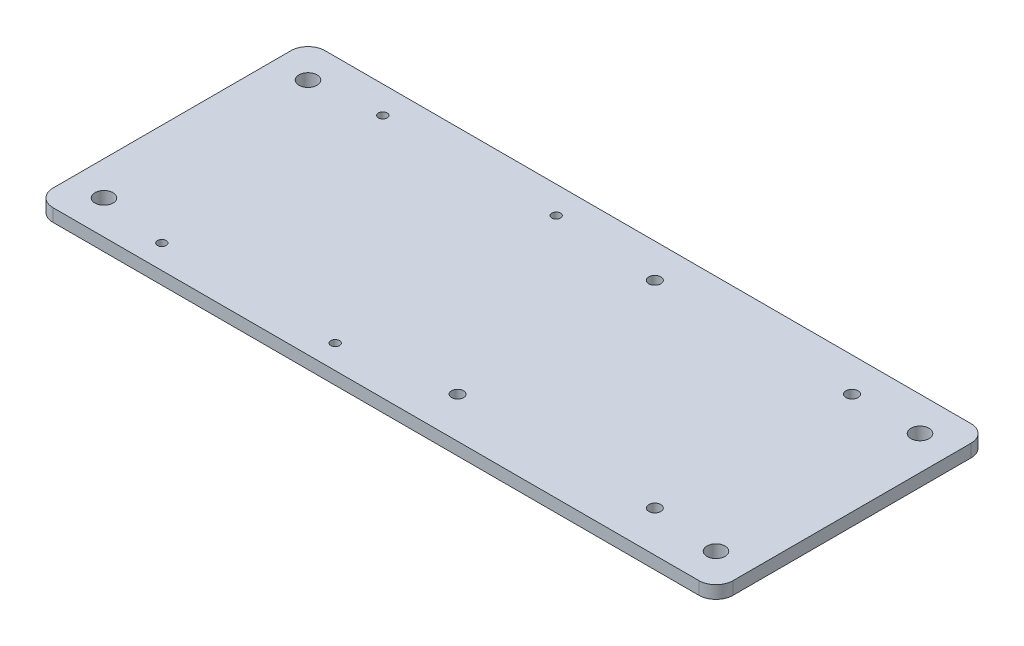
ISO-10303-21;
HEADER;
FILE_DESCRIPTION(('STEP AP214'),'2;1');
FILE_NAME('part.step','',(''),(''),'','','');
FILE_SCHEMA(('AUTOMOTIVE_DESIGN { 1 0 10303 214 1 1 1 1 }'));
ENDSEC;
DATA;
#1=APPLICATION_CONTEXT('core data for automotive mechanical design processes');
#2=APPLICATION_PROTOCOL_DEFINITION('international standard','automotive_design',2000,#1);
#3=PRODUCT_CONTEXT('',#1,'mechanical');
#4=PRODUCT('Part','Part','',(#3));
#5=PRODUCT_RELATED_PRODUCT_CATEGORY('part','',(#4));
#6=PRODUCT_DEFINITION_FORMATION('','',#4);
#7=PRODUCT_DEFINITION_CONTEXT('part definition',#1,'design');
#8=PRODUCT_DEFINITION('design','',#6,#7);
#9=PRODUCT_DEFINITION_SHAPE('','',#8);
#10=(LENGTH_UNIT() NAMED_UNIT(*) SI_UNIT(.MILLI.,.METRE.));
#11=(NAMED_UNIT(*) PLANE_ANGLE_UNIT() SI_UNIT($,.RADIAN.));
#12=(NAMED_UNIT(*) SI_UNIT($,.STERADIAN.) SOLID_ANGLE_UNIT());
#13=UNCERTAINTY_MEASURE_WITH_UNIT(LENGTH_MEASURE(1.E-05),#10,'distance_accuracy_value','');
#14=(GEOMETRIC_REPRESENTATION_CONTEXT(3) GLOBAL_UNCERTAINTY_ASSIGNED_CONTEXT((#13)) GLOBAL_UNIT_ASSIGNED_CONTEXT((#10,
#11,#12)) REPRESENTATION_CONTEXT('',''));
#15=CARTESIAN_POINT('',(0.,0.,0.));
#16=DIRECTION('',(0.,0.,1.));
#17=DIRECTION('',(1.,0.,0.));
#18=AXIS2_PLACEMENT_3D('',#15,#16,#17);
#19=CARTESIAN_POINT('',(0.,4.7625,0.));
#20=DIRECTION('',(1.,0.,0.));
#21=DIRECTION('',(0.,0.,-1.));
#22=AXIS2_PLACEMENT_3D('',#19,#20,#21);
#23=PLANE('',#22);
#24=DIRECTION('',(0.,0.,1.));
#25=VECTOR('',#24,1.);
#26=CARTESIAN_POINT('',(0.,0.,0.));
#27=LINE('',#26,#25);
#28=CARTESIAN_POINT('',(0.,0.,6.35));
#29=VERTEX_POINT('',#28);
#30=CARTESIAN_POINT('',(0.,0.,95.25));
#31=VERTEX_POINT('',#30);
#32=EDGE_CURVE('E212',#29,#31,#27,.T.);
#33=ORIENTED_EDGE('',*,*,#32,.T.);
#34=DIRECTION('',(0.,-1.,0.));
#35=VECTOR('',#34,1.);
#36=CARTESIAN_POINT('',(0.,4.7625,95.25));
#37=LINE('',#36,#35);
#38=CARTESIAN_POINT('',(0.,4.7625,95.25));
#39=VERTEX_POINT('',#38);
#40=EDGE_CURVE('E12',#31,#39,#37,.F.);
#41=ORIENTED_EDGE('',*,*,#40,.T.);
#42=DIRECTION('',(0.,0.,1.));
#43=VECTOR('',#42,1.);
#44=CARTESIAN_POINT('',(0.,4.7625,0.));
#45=LINE('',#44,#43);
#46=CARTESIAN_POINT('',(0.,4.7625,6.35));
#47=VERTEX_POINT('',#46);
#48=EDGE_CURVE('E141',#47,#39,#45,.T.);
#49=ORIENTED_EDGE('',*,*,#48,.F.);
#50=DIRECTION('',(0.,-1.,0.));
#51=VECTOR('',#50,1.);
#52=CARTESIAN_POINT('',(0.,4.7625,6.35));
#53=LINE('',#52,#51);
#54=EDGE_CURVE('E54',#47,#29,#53,.T.);
#55=ORIENTED_EDGE('',*,*,#54,.T.);
#56=EDGE_LOOP('',(#33,#41,#49,#55));
#57=FACE_BOUND('',#56,.T.);
#58=ADVANCED_FACE('F45',(#57),#23,.F.);
#59=CARTESIAN_POINT('',(0.,4.7625,101.6));
#60=DIRECTION('',(0.,0.,-1.));
#61=DIRECTION('',(-1.,0.,0.));
#62=AXIS2_PLACEMENT_3D('',#59,#60,#61);
#63=PLANE('',#62);
#64=DIRECTION('',(1.,0.,0.));
#65=VECTOR('',#64,1.);
#66=CARTESIAN_POINT('',(0.,0.,101.6));
#67=LINE('',#66,#65);
#68=CARTESIAN_POINT('',(6.35000000000001,0.,101.6));
#69=VERTEX_POINT('',#68);
#70=CARTESIAN_POINT('',(247.65,0.,101.6));
#71=VERTEX_POINT('',#70);
#72=EDGE_CURVE('E148',#69,#71,#67,.T.);
#73=ORIENTED_EDGE('',*,*,#72,.T.);
#74=DIRECTION('',(0.,-1.,0.));
#75=VECTOR('',#74,1.);
#76=CARTESIAN_POINT('',(247.65,4.7625,101.6));
#77=LINE('',#76,#75);
#78=CARTESIAN_POINT('',(247.65,4.7625,101.6));
#79=VERTEX_POINT('',#78);
#80=EDGE_CURVE('E61',#71,#79,#77,.F.);
#81=ORIENTED_EDGE('',*,*,#80,.T.);
#82=DIRECTION('',(1.,0.,0.));
#83=VECTOR('',#82,1.);
#84=CARTESIAN_POINT('',(0.,4.7625,101.6));
#85=LINE('',#84,#83);
#86=CARTESIAN_POINT('',(6.35000000000001,4.7625,101.6));
#87=VERTEX_POINT('',#86);
#88=EDGE_CURVE('E146',#87,#79,#85,.T.);
#89=ORIENTED_EDGE('',*,*,#88,.F.);
#90=DIRECTION('',(0.,-1.,0.));
#91=VECTOR('',#90,1.);
#92=CARTESIAN_POINT('',(6.35000000000001,4.7625,101.6));
#93=LINE('',#92,#91);
#94=EDGE_CURVE('E199',#87,#69,#93,.T.);
#95=ORIENTED_EDGE('',*,*,#94,.T.);
#96=EDGE_LOOP('',(#73,#81,#89,#95));
#97=FACE_BOUND('',#96,.T.);
#98=ADVANCED_FACE('F349',(#97),#63,.F.);
#99=CARTESIAN_POINT('',(254.,4.7625,0.));
#100=DIRECTION('',(-1.,0.,0.));
#101=DIRECTION('',(0.,0.,1.));
#102=AXIS2_PLACEMENT_3D('',#99,#100,#101);
#103=PLANE('',#102);
#104=DIRECTION('',(0.,0.,-1.));
#105=VECTOR('',#104,1.);
#106=CARTESIAN_POINT('',(254.,0.,0.));
#107=LINE('',#106,#105);
#108=CARTESIAN_POINT('',(254.,0.,95.25));
#109=VERTEX_POINT('',#108);
#110=CARTESIAN_POINT('',(254.,0.,6.35));
#111=VERTEX_POINT('',#110);
#112=EDGE_CURVE('E142',#109,#111,#107,.T.);
#113=ORIENTED_EDGE('',*,*,#112,.T.);
#114=DIRECTION('',(0.,-1.,0.));
#115=VECTOR('',#114,1.);
#116=CARTESIAN_POINT('',(254.,4.7625,6.35));
#117=LINE('',#116,#115);
#118=CARTESIAN_POINT('',(254.,4.7625,6.35));
#119=VERTEX_POINT('',#118);
#120=EDGE_CURVE('E117',#111,#119,#117,.F.);
#121=ORIENTED_EDGE('',*,*,#120,.T.);
#122=DIRECTION('',(0.,0.,-1.));
#123=VECTOR('',#122,1.);
#124=CARTESIAN_POINT('',(254.,4.7625,0.));
#125=LINE('',#124,#123);
#126=CARTESIAN_POINT('',(254.,4.7625,95.25));
#127=VERTEX_POINT('',#126);
#128=EDGE_CURVE('E185',#127,#119,#125,.T.);
#129=ORIENTED_EDGE('',*,*,#128,.F.);
#130=DIRECTION('',(0.,-1.,0.));
#131=VECTOR('',#130,1.);
#132=CARTESIAN_POINT('',(254.,4.7625,95.25));
#133=LINE('',#132,#131);
#134=EDGE_CURVE('E123',#127,#109,#133,.T.);
#135=ORIENTED_EDGE('',*,*,#134,.T.);
#136=EDGE_LOOP('',(#113,#121,#129,#135));
#137=FACE_BOUND('',#136,.T.);
#138=ADVANCED_FACE('F354',(#137),#103,.F.);
#139=CARTESIAN_POINT('',(0.,4.7625,0.));
#140=DIRECTION('',(0.,0.,1.));
#141=DIRECTION('',(1.,0.,0.));
#142=AXIS2_PLACEMENT_3D('',#139,#140,#141);
#143=PLANE('',#142);
#144=DIRECTION('',(-1.,0.,0.));
#145=VECTOR('',#144,1.);
#146=CARTESIAN_POINT('',(0.,4.7625,0.));
#147=LINE('',#146,#145);
#148=CARTESIAN_POINT('',(247.65,4.7625,0.));
#149=VERTEX_POINT('',#148);
#150=CARTESIAN_POINT('',(6.35,4.7625,0.));
#151=VERTEX_POINT('',#150);
#152=EDGE_CURVE('E133',#149,#151,#147,.T.);
#153=ORIENTED_EDGE('',*,*,#152,.F.);
#154=DIRECTION('',(0.,-1.,0.));
#155=VECTOR('',#154,1.);
#156=CARTESIAN_POINT('',(247.65,4.7625,0.));
#157=LINE('',#156,#155);
#158=CARTESIAN_POINT('',(247.65,0.,0.));
#159=VERTEX_POINT('',#158);
#160=EDGE_CURVE('E116',#149,#159,#157,.T.);
#161=ORIENTED_EDGE('',*,*,#160,.T.);
#162=DIRECTION('',(-1.,0.,0.));
#163=VECTOR('',#162,1.);
#164=CARTESIAN_POINT('',(0.,0.,0.));
#165=LINE('',#164,#163);
#166=CARTESIAN_POINT('',(6.35,0.,0.));
#167=VERTEX_POINT('',#166);
#168=EDGE_CURVE('E130',#159,#167,#165,.T.);
#169=ORIENTED_EDGE('',*,*,#168,.T.);
#170=DIRECTION('',(0.,-1.,0.));
#171=VECTOR('',#170,1.);
#172=CARTESIAN_POINT('',(6.35,4.7625,0.));
#173=LINE('',#172,#171);
#174=EDGE_CURVE('E136',#167,#151,#173,.F.);
#175=ORIENTED_EDGE('',*,*,#174,.T.);
#176=EDGE_LOOP('',(#153,#161,#169,#175));
#177=FACE_BOUND('',#176,.T.);
#178=ADVANCED_FACE('F129',(#177),#143,.F.);
#179=CARTESIAN_POINT('',(0.,4.7625,0.));
#180=DIRECTION('',(0.,1.,0.));
#181=DIRECTION('',(0.,0.,1.));
#182=AXIS2_PLACEMENT_3D('',#179,#180,#181);
#183=PLANE('',#182);
#184=CARTESIAN_POINT('',(38.1,4.7625,10.16));
#185=DIRECTION('',(0.,1.,0.));
#186=DIRECTION('',(0.,0.,1.));
#187=AXIS2_PLACEMENT_3D('',#184,#185,#186);
#188=CIRCLE('',#187,1.63195);
#189=CARTESIAN_POINT('',(38.1,4.7625,11.79195));
#190=VERTEX_POINT('',#189);
#191=EDGE_CURVE('E326',#190,#190,#188,.T.);
#192=ORIENTED_EDGE('',*,*,#191,.F.);
#193=EDGE_LOOP('',(#192));
#194=FACE_BOUND('',#193,.T.);
#195=CARTESIAN_POINT('',(102.87,4.7625,10.16));
#196=DIRECTION('',(0.,1.,0.));
#197=DIRECTION('',(0.,0.,1.));
#198=AXIS2_PLACEMENT_3D('',#195,#196,#197);
#199=CIRCLE('',#198,1.63194999999999);
#200=CARTESIAN_POINT('',(102.87,4.7625,11.79195));
#201=VERTEX_POINT('',#200);
#202=EDGE_CURVE('E318',#201,#201,#199,.T.);
#203=ORIENTED_EDGE('',*,*,#202,.F.);
#204=EDGE_LOOP('',(#203));
#205=FACE_BOUND('',#204,.T.);
#206=CARTESIAN_POINT('',(102.87,4.7625,92.71));
#207=DIRECTION('',(0.,1.,0.));
#208=DIRECTION('',(0.,0.,1.));
#209=AXIS2_PLACEMENT_3D('',#206,#207,#208);
#210=CIRCLE('',#209,1.63194999999999);
#211=CARTESIAN_POINT('',(102.87,4.7625,94.34195));
#212=VERTEX_POINT('',#211);
#213=EDGE_CURVE('E309',#212,#212,#210,.T.);
#214=ORIENTED_EDGE('',*,*,#213,.F.);
#215=EDGE_LOOP('',(#214));
#216=FACE_BOUND('',#215,.T.);
#217=CARTESIAN_POINT('',(38.1,4.7625,92.71));
#218=DIRECTION('',(0.,1.,0.));
#219=DIRECTION('',(0.,0.,1.));
#220=AXIS2_PLACEMENT_3D('',#217,#218,#219);
#221=CIRCLE('',#220,1.63195);
#222=CARTESIAN_POINT('',(38.1,4.7625,94.34195));
#223=VERTEX_POINT('',#222);
#224=EDGE_CURVE('E301',#223,#223,#221,.T.);
#225=ORIENTED_EDGE('',*,*,#224,.F.);
#226=EDGE_LOOP('',(#225));
#227=FACE_BOUND('',#226,.T.);
#228=CARTESIAN_POINT('',(142.24,4.7625,12.7));
#229=DIRECTION('',(0.,1.,0.));
#230=DIRECTION('',(0.,0.,1.));
#231=AXIS2_PLACEMENT_3D('',#228,#229,#230);
#232=CIRCLE('',#231,2.2479);
#233=CARTESIAN_POINT('',(142.24,4.7625,14.9479));
#234=VERTEX_POINT('',#233);
#235=EDGE_CURVE('E290',#234,#234,#232,.T.);
#236=ORIENTED_EDGE('',*,*,#235,.F.);
#237=EDGE_LOOP('',(#236));
#238=FACE_BOUND('',#237,.T.);
#239=CARTESIAN_POINT('',(215.9,4.7625,12.7));
#240=DIRECTION('',(0.,1.,0.));
#241=DIRECTION('',(0.,0.,1.));
#242=AXIS2_PLACEMENT_3D('',#239,#240,#241);
#243=CIRCLE('',#242,2.2479);
#244=CARTESIAN_POINT('',(215.9,4.7625,14.9479));
#245=VERTEX_POINT('',#244);
#246=EDGE_CURVE('E281',#245,#245,#243,.T.);
#247=ORIENTED_EDGE('',*,*,#246,.F.);
#248=EDGE_LOOP('',(#247));
#249=FACE_BOUND('',#248,.T.);
#250=CARTESIAN_POINT('',(215.9,4.7625,86.36));
#251=DIRECTION('',(0.,1.,0.));
#252=DIRECTION('',(0.,0.,1.));
#253=AXIS2_PLACEMENT_3D('',#250,#251,#252);
#254=CIRCLE('',#253,2.2479);
#255=CARTESIAN_POINT('',(215.9,4.7625,88.6079));
#256=VERTEX_POINT('',#255);
#257=EDGE_CURVE('E273',#256,#256,#254,.T.);
#258=ORIENTED_EDGE('',*,*,#257,.F.);
#259=EDGE_LOOP('',(#258));
#260=FACE_BOUND('',#259,.T.);
#261=CARTESIAN_POINT('',(142.24,4.7625,86.36));
#262=DIRECTION('',(0.,1.,0.));
#263=DIRECTION('',(0.,0.,1.));
#264=AXIS2_PLACEMENT_3D('',#261,#262,#263);
#265=CIRCLE('',#264,2.2479);
#266=CARTESIAN_POINT('',(142.24,4.7625,88.6079));
#267=VERTEX_POINT('',#266);
#268=EDGE_CURVE('E262',#267,#267,#265,.T.);
#269=ORIENTED_EDGE('',*,*,#268,.F.);
#270=EDGE_LOOP('',(#269));
#271=FACE_BOUND('',#270,.T.);
#272=CARTESIAN_POINT('',(12.7,4.7625,12.7));
#273=DIRECTION('',(0.,1.,0.));
#274=DIRECTION('',(0.,0.,1.));
#275=AXIS2_PLACEMENT_3D('',#272,#273,#274);
#276=CIRCLE('',#275,3.3782);
#277=CARTESIAN_POINT('',(12.7,4.7625,16.0782));
#278=VERTEX_POINT('',#277);
#279=EDGE_CURVE('E253',#278,#278,#276,.T.);
#280=ORIENTED_EDGE('',*,*,#279,.F.);
#281=EDGE_LOOP('',(#280));
#282=FACE_BOUND('',#281,.T.);
#283=CARTESIAN_POINT('',(12.7,4.7625,88.9));
#284=DIRECTION('',(0.,1.,0.));
#285=DIRECTION('',(0.,0.,1.));
#286=AXIS2_PLACEMENT_3D('',#283,#284,#285);
#287=CIRCLE('',#286,3.3782);
#288=CARTESIAN_POINT('',(12.7,4.7625,92.2782));
#289=VERTEX_POINT('',#288);
#290=EDGE_CURVE('E245',#289,#289,#287,.T.);
#291=ORIENTED_EDGE('',*,*,#290,.F.);
#292=EDGE_LOOP('',(#291));
#293=FACE_BOUND('',#292,.T.);
#294=CARTESIAN_POINT('',(241.3,4.7625,88.9));
#295=DIRECTION('',(0.,1.,0.));
#296=DIRECTION('',(0.,0.,1.));
#297=AXIS2_PLACEMENT_3D('',#294,#295,#296);
#298=CIRCLE('',#297,3.3782);
#299=CARTESIAN_POINT('',(241.3,4.7625,92.2782));
#300=VERTEX_POINT('',#299);
#301=EDGE_CURVE('E231',#300,#300,#298,.T.);
#302=ORIENTED_EDGE('',*,*,#301,.F.);
#303=EDGE_LOOP('',(#302));
#304=FACE_BOUND('',#303,.T.);
#305=CARTESIAN_POINT('',(241.3,4.7625,12.7));
#306=DIRECTION('',(0.,1.,0.));
#307=DIRECTION('',(0.,0.,1.));
#308=AXIS2_PLACEMENT_3D('',#305,#306,#307);
#309=CIRCLE('',#308,3.3782);
#310=CARTESIAN_POINT('',(241.3,4.7625,16.0782));
#311=VERTEX_POINT('',#310);
#312=EDGE_CURVE('E221',#311,#311,#309,.T.);
#313=ORIENTED_EDGE('',*,*,#312,.F.);
#314=EDGE_LOOP('',(#313));
#315=FACE_BOUND('',#314,.T.);
#316=ORIENTED_EDGE('',*,*,#128,.T.);
#317=CARTESIAN_POINT('',(247.65,4.7625,6.35));
#318=DIRECTION('',(0.,1.,0.));
#319=DIRECTION('',(0.,0.,1.));
#320=AXIS2_PLACEMENT_3D('',#317,#318,#319);
#321=CIRCLE('',#320,6.35);
#322=EDGE_CURVE('E195',#119,#149,#321,.T.);
#323=ORIENTED_EDGE('',*,*,#322,.T.);
#324=ORIENTED_EDGE('',*,*,#152,.T.);
#325=CARTESIAN_POINT('',(6.35,4.7625,6.35));
#326=DIRECTION('',(0.,1.,0.));
#327=DIRECTION('',(0.,0.,1.));
#328=AXIS2_PLACEMENT_3D('',#325,#326,#327);
#329=CIRCLE('',#328,6.35);
#330=EDGE_CURVE('E166',#151,#47,#329,.T.);
#331=ORIENTED_EDGE('',*,*,#330,.T.);
#332=ORIENTED_EDGE('',*,*,#48,.T.);
#333=CARTESIAN_POINT('',(6.35000000000001,4.7625,95.25));
#334=DIRECTION('',(0.,1.,0.));
#335=DIRECTION('',(0.,0.,1.));
#336=AXIS2_PLACEMENT_3D('',#333,#334,#335);
#337=CIRCLE('',#336,6.35);
#338=EDGE_CURVE('E68',#39,#87,#337,.T.);
#339=ORIENTED_EDGE('',*,*,#338,.T.);
#340=ORIENTED_EDGE('',*,*,#88,.T.);
#341=CARTESIAN_POINT('',(247.65,4.7625,95.25));
#342=DIRECTION('',(0.,1.,0.));
#343=DIRECTION('',(0.,0.,1.));
#344=AXIS2_PLACEMENT_3D('',#341,#342,#343);
#345=CIRCLE('',#344,6.35);
#346=EDGE_CURVE('E200',#79,#127,#345,.T.);
#347=ORIENTED_EDGE('',*,*,#346,.T.);
#348=EDGE_LOOP('',(#316,#323,#324,#331,#332,#339,#340,#347));
#349=FACE_BOUND('',#348,.T.);
#350=ADVANCED_FACE('F375',(#194,#205,#216,#227,#238,#249,#260,#271,#282,#293,#304,#315,#349),
#183,.T.);
#351=CARTESIAN_POINT('',(0.,0.,0.));
#352=DIRECTION('',(0.,1.,0.));
#353=DIRECTION('',(0.,0.,1.));
#354=AXIS2_PLACEMENT_3D('',#351,#352,#353);
#355=PLANE('',#354);
#356=CARTESIAN_POINT('',(38.1,0.,10.16));
#357=DIRECTION('',(0.,1.,0.));
#358=DIRECTION('',(0.,0.,1.));
#359=AXIS2_PLACEMENT_3D('',#356,#357,#358);
#360=CIRCLE('',#359,1.63195);
#361=CARTESIAN_POINT('',(38.1,0.,11.79195));
#362=VERTEX_POINT('',#361);
#363=EDGE_CURVE('E323',#362,#362,#360,.T.);
#364=ORIENTED_EDGE('',*,*,#363,.T.);
#365=EDGE_LOOP('',(#364));
#366=FACE_BOUND('',#365,.T.);
#367=CARTESIAN_POINT('',(102.87,0.,10.16));
#368=DIRECTION('',(0.,1.,0.));
#369=DIRECTION('',(0.,0.,1.));
#370=AXIS2_PLACEMENT_3D('',#367,#368,#369);
#371=CIRCLE('',#370,1.63194999999999);
#372=CARTESIAN_POINT('',(102.87,0.,11.79195));
#373=VERTEX_POINT('',#372);
#374=EDGE_CURVE('E314',#373,#373,#371,.T.);
#375=ORIENTED_EDGE('',*,*,#374,.T.);
#376=EDGE_LOOP('',(#375));
#377=FACE_BOUND('',#376,.T.);
#378=CARTESIAN_POINT('',(102.87,0.,92.71));
#379=DIRECTION('',(0.,1.,0.));
#380=DIRECTION('',(0.,0.,1.));
#381=AXIS2_PLACEMENT_3D('',#378,#379,#380);
#382=CIRCLE('',#381,1.63194999999999);
#383=CARTESIAN_POINT('',(102.87,0.,94.34195));
#384=VERTEX_POINT('',#383);
#385=EDGE_CURVE('E306',#384,#384,#382,.T.);
#386=ORIENTED_EDGE('',*,*,#385,.T.);
#387=EDGE_LOOP('',(#386));
#388=FACE_BOUND('',#387,.T.);
#389=CARTESIAN_POINT('',(38.1,0.,92.71));
#390=DIRECTION('',(0.,1.,0.));
#391=DIRECTION('',(0.,0.,1.));
#392=AXIS2_PLACEMENT_3D('',#389,#390,#391);
#393=CIRCLE('',#392,1.63195);
#394=CARTESIAN_POINT('',(38.1,0.,94.34195));
#395=VERTEX_POINT('',#394);
#396=EDGE_CURVE('E295',#395,#395,#393,.T.);
#397=ORIENTED_EDGE('',*,*,#396,.T.);
#398=EDGE_LOOP('',(#397));
#399=FACE_BOUND('',#398,.T.);
#400=CARTESIAN_POINT('',(142.24,0.,12.7));
#401=DIRECTION('',(0.,1.,0.));
#402=DIRECTION('',(0.,0.,1.));
#403=AXIS2_PLACEMENT_3D('',#400,#401,#402);
#404=CIRCLE('',#403,2.2479);
#405=CARTESIAN_POINT('',(142.24,0.,14.9479));
#406=VERTEX_POINT('',#405);
#407=EDGE_CURVE('E286',#406,#406,#404,.T.);
#408=ORIENTED_EDGE('',*,*,#407,.T.);
#409=EDGE_LOOP('',(#408));
#410=FACE_BOUND('',#409,.T.);
#411=CARTESIAN_POINT('',(215.9,0.,12.7));
#412=DIRECTION('',(0.,1.,0.));
#413=DIRECTION('',(0.,0.,1.));
#414=AXIS2_PLACEMENT_3D('',#411,#412,#413);
#415=CIRCLE('',#414,2.2479);
#416=CARTESIAN_POINT('',(215.9,0.,14.9479));
#417=VERTEX_POINT('',#416);
#418=EDGE_CURVE('E278',#417,#417,#415,.T.);
#419=ORIENTED_EDGE('',*,*,#418,.T.);
#420=EDGE_LOOP('',(#419));
#421=FACE_BOUND('',#420,.T.);
#422=CARTESIAN_POINT('',(215.9,0.,86.36));
#423=DIRECTION('',(0.,1.,0.));
#424=DIRECTION('',(0.,0.,1.));
#425=AXIS2_PLACEMENT_3D('',#422,#423,#424);
#426=CIRCLE('',#425,2.2479);
#427=CARTESIAN_POINT('',(215.9,0.,88.6079));
#428=VERTEX_POINT('',#427);
#429=EDGE_CURVE('E267',#428,#428,#426,.T.);
#430=ORIENTED_EDGE('',*,*,#429,.T.);
#431=EDGE_LOOP('',(#430));
#432=FACE_BOUND('',#431,.T.);
#433=CARTESIAN_POINT('',(142.24,0.,86.36));
#434=DIRECTION('',(0.,1.,0.));
#435=DIRECTION('',(0.,0.,1.));
#436=AXIS2_PLACEMENT_3D('',#433,#434,#435);
#437=CIRCLE('',#436,2.2479);
#438=CARTESIAN_POINT('',(142.24,0.,88.6079));
#439=VERTEX_POINT('',#438);
#440=EDGE_CURVE('E258',#439,#439,#437,.T.);
#441=ORIENTED_EDGE('',*,*,#440,.T.);
#442=EDGE_LOOP('',(#441));
#443=FACE_BOUND('',#442,.T.);
#444=CARTESIAN_POINT('',(12.7,0.,12.7));
#445=DIRECTION('',(0.,1.,0.));
#446=DIRECTION('',(0.,0.,1.));
#447=AXIS2_PLACEMENT_3D('',#444,#445,#446);
#448=CIRCLE('',#447,3.3782);
#449=CARTESIAN_POINT('',(12.7,0.,16.0782));
#450=VERTEX_POINT('',#449);
#451=EDGE_CURVE('E250',#450,#450,#448,.T.);
#452=ORIENTED_EDGE('',*,*,#451,.T.);
#453=EDGE_LOOP('',(#452));
#454=FACE_BOUND('',#453,.T.);
#455=CARTESIAN_POINT('',(12.7,0.,88.9));
#456=DIRECTION('',(0.,1.,0.));
#457=DIRECTION('',(0.,0.,1.));
#458=AXIS2_PLACEMENT_3D('',#455,#456,#457);
#459=CIRCLE('',#458,3.3782);
#460=CARTESIAN_POINT('',(12.7,0.,92.2782));
#461=VERTEX_POINT('',#460);
#462=EDGE_CURVE('E239',#461,#461,#459,.T.);
#463=ORIENTED_EDGE('',*,*,#462,.T.);
#464=EDGE_LOOP('',(#463));
#465=FACE_BOUND('',#464,.T.);
#466=CARTESIAN_POINT('',(241.3,0.,88.9));
#467=DIRECTION('',(0.,1.,0.));
#468=DIRECTION('',(0.,0.,1.));
#469=AXIS2_PLACEMENT_3D('',#466,#467,#468);
#470=CIRCLE('',#469,3.3782);
#471=CARTESIAN_POINT('',(241.3,0.,92.2782));
#472=VERTEX_POINT('',#471);
#473=EDGE_CURVE('E226',#472,#472,#470,.T.);
#474=ORIENTED_EDGE('',*,*,#473,.T.);
#475=EDGE_LOOP('',(#474));
#476=FACE_BOUND('',#475,.T.);
#477=CARTESIAN_POINT('',(241.3,0.,12.7));
#478=DIRECTION('',(0.,1.,0.));
#479=DIRECTION('',(0.,0.,1.));
#480=AXIS2_PLACEMENT_3D('',#477,#478,#479);
#481=CIRCLE('',#480,3.3782);
#482=CARTESIAN_POINT('',(241.3,0.,16.0782));
#483=VERTEX_POINT('',#482);
#484=EDGE_CURVE('E180',#483,#483,#481,.T.);
#485=ORIENTED_EDGE('',*,*,#484,.T.);
#486=EDGE_LOOP('',(#485));
#487=FACE_BOUND('',#486,.T.);
#488=ORIENTED_EDGE('',*,*,#168,.F.);
#489=CARTESIAN_POINT('',(247.65,0.,6.35));
#490=DIRECTION('',(0.,1.,0.));
#491=DIRECTION('',(0.,0.,1.));
#492=AXIS2_PLACEMENT_3D('',#489,#490,#491);
#493=CIRCLE('',#492,6.35);
#494=EDGE_CURVE('E112',#159,#111,#493,.F.);
#495=ORIENTED_EDGE('',*,*,#494,.T.);
#496=ORIENTED_EDGE('',*,*,#112,.F.);
#497=CARTESIAN_POINT('',(247.65,0.,95.25));
#498=DIRECTION('',(0.,1.,0.));
#499=DIRECTION('',(0.,0.,1.));
#500=AXIS2_PLACEMENT_3D('',#497,#498,#499);
#501=CIRCLE('',#500,6.35);
#502=EDGE_CURVE('E124',#109,#71,#501,.F.);
#503=ORIENTED_EDGE('',*,*,#502,.T.);
#504=ORIENTED_EDGE('',*,*,#72,.F.);
#505=CARTESIAN_POINT('',(6.35000000000001,0.,95.25));
#506=DIRECTION('',(0.,1.,0.));
#507=DIRECTION('',(0.,0.,1.));
#508=AXIS2_PLACEMENT_3D('',#505,#506,#507);
#509=CIRCLE('',#508,6.35);
#510=EDGE_CURVE('E156',#69,#31,#509,.F.);
#511=ORIENTED_EDGE('',*,*,#510,.T.);
#512=ORIENTED_EDGE('',*,*,#32,.F.);
#513=CARTESIAN_POINT('',(6.35,0.,6.35));
#514=DIRECTION('',(0.,1.,0.));
#515=DIRECTION('',(0.,0.,1.));
#516=AXIS2_PLACEMENT_3D('',#513,#514,#515);
#517=CIRCLE('',#516,6.35);
#518=EDGE_CURVE('E135',#29,#167,#517,.F.);
#519=ORIENTED_EDGE('',*,*,#518,.T.);
#520=EDGE_LOOP('',(#488,#495,#496,#503,#504,#511,#512,#519));
#521=FACE_BOUND('',#520,.T.);
#522=ADVANCED_FACE('F138',(#366,#377,#388,#399,#410,#421,#432,#443,#454,#465,#476,#487,#521),
#355,.F.);
#523=CARTESIAN_POINT('',(247.65,4.7625,6.35));
#524=DIRECTION('',(0.,-1.,0.));
#525=DIRECTION('',(0.,0.,-1.));
#526=AXIS2_PLACEMENT_3D('',#523,#524,#525);
#527=CYLINDRICAL_SURFACE('',#526,6.35);
#528=ORIENTED_EDGE('',*,*,#322,.F.);
#529=ORIENTED_EDGE('',*,*,#120,.F.);
#530=ORIENTED_EDGE('',*,*,#494,.F.);
#531=ORIENTED_EDGE('',*,*,#160,.F.);
#532=EDGE_LOOP('',(#528,#529,#530,#531));
#533=FACE_BOUND('',#532,.T.);
#534=ADVANCED_FACE('F115',(#533),#527,.T.);
#535=CARTESIAN_POINT('',(247.65,4.7625,95.25));
#536=DIRECTION('',(0.,-1.,0.));
#537=DIRECTION('',(0.,0.,-1.));
#538=AXIS2_PLACEMENT_3D('',#535,#536,#537);
#539=CYLINDRICAL_SURFACE('',#538,6.35);
#540=ORIENTED_EDGE('',*,*,#346,.F.);
#541=ORIENTED_EDGE('',*,*,#80,.F.);
#542=ORIENTED_EDGE('',*,*,#502,.F.);
#543=ORIENTED_EDGE('',*,*,#134,.F.);
#544=EDGE_LOOP('',(#540,#541,#542,#543));
#545=FACE_BOUND('',#544,.T.);
#546=ADVANCED_FACE('F360',(#545),#539,.T.);
#547=CARTESIAN_POINT('',(6.35000000000001,4.7625,95.25));
#548=DIRECTION('',(0.,-1.,0.));
#549=DIRECTION('',(0.,0.,-1.));
#550=AXIS2_PLACEMENT_3D('',#547,#548,#549);
#551=CYLINDRICAL_SURFACE('',#550,6.35);
#552=ORIENTED_EDGE('',*,*,#338,.F.);
#553=ORIENTED_EDGE('',*,*,#40,.F.);
#554=ORIENTED_EDGE('',*,*,#510,.F.);
#555=ORIENTED_EDGE('',*,*,#94,.F.);
#556=EDGE_LOOP('',(#552,#553,#554,#555));
#557=FACE_BOUND('',#556,.T.);
#558=ADVANCED_FACE('F362',(#557),#551,.T.);
#559=CARTESIAN_POINT('',(6.35,4.7625,6.35));
#560=DIRECTION('',(0.,-1.,0.));
#561=DIRECTION('',(0.,0.,-1.));
#562=AXIS2_PLACEMENT_3D('',#559,#560,#561);
#563=CYLINDRICAL_SURFACE('',#562,6.35);
#564=ORIENTED_EDGE('',*,*,#330,.F.);
#565=ORIENTED_EDGE('',*,*,#174,.F.);
#566=ORIENTED_EDGE('',*,*,#518,.F.);
#567=ORIENTED_EDGE('',*,*,#54,.F.);
#568=EDGE_LOOP('',(#564,#565,#566,#567));
#569=FACE_BOUND('',#568,.T.);
#570=ADVANCED_FACE('F47',(#569),#563,.T.);
#571=CARTESIAN_POINT('',(241.3,4.7625,12.7));
#572=DIRECTION('',(0.,1.,0.));
#573=DIRECTION('',(0.,0.,1.));
#574=AXIS2_PLACEMENT_3D('',#571,#572,#573);
#575=CYLINDRICAL_SURFACE('',#574,3.3782);
#576=ORIENTED_EDGE('',*,*,#484,.F.);
#577=EDGE_LOOP('',(#576));
#578=FACE_BOUND('',#577,.T.);
#579=ORIENTED_EDGE('',*,*,#312,.T.);
#580=EDGE_LOOP('',(#579));
#581=FACE_BOUND('',#580,.T.);
#582=ADVANCED_FACE('F369',(#578,#581),#575,.F.);
#583=CARTESIAN_POINT('',(241.3,4.7625,88.9));
#584=DIRECTION('',(0.,1.,0.));
#585=DIRECTION('',(0.,0.,1.));
#586=AXIS2_PLACEMENT_3D('',#583,#584,#585);
#587=CYLINDRICAL_SURFACE('',#586,3.3782);
#588=ORIENTED_EDGE('',*,*,#473,.F.);
#589=EDGE_LOOP('',(#588));
#590=FACE_BOUND('',#589,.T.);
#591=ORIENTED_EDGE('',*,*,#301,.T.);
#592=EDGE_LOOP('',(#591));
#593=FACE_BOUND('',#592,.T.);
#594=ADVANCED_FACE('F391',(#590,#593),#587,.F.);
#595=CARTESIAN_POINT('',(12.7,4.7625,88.9));
#596=DIRECTION('',(0.,1.,0.));
#597=DIRECTION('',(0.,0.,1.));
#598=AXIS2_PLACEMENT_3D('',#595,#596,#597);
#599=CYLINDRICAL_SURFACE('',#598,3.3782);
#600=ORIENTED_EDGE('',*,*,#462,.F.);
#601=EDGE_LOOP('',(#600));
#602=FACE_BOUND('',#601,.T.);
#603=ORIENTED_EDGE('',*,*,#290,.T.);
#604=EDGE_LOOP('',(#603));
#605=FACE_BOUND('',#604,.T.);
#606=ADVANCED_FACE('F395',(#602,#605),#599,.F.);
#607=CARTESIAN_POINT('',(12.7,4.7625,12.7));
#608=DIRECTION('',(0.,1.,0.));
#609=DIRECTION('',(0.,0.,1.));
#610=AXIS2_PLACEMENT_3D('',#607,#608,#609);
#611=CYLINDRICAL_SURFACE('',#610,3.3782);
#612=ORIENTED_EDGE('',*,*,#451,.F.);
#613=EDGE_LOOP('',(#612));
#614=FACE_BOUND('',#613,.T.);
#615=ORIENTED_EDGE('',*,*,#279,.T.);
#616=EDGE_LOOP('',(#615));
#617=FACE_BOUND('',#616,.T.);
#618=ADVANCED_FACE('F399',(#614,#617),#611,.F.);
#619=CARTESIAN_POINT('',(142.24,4.7625,86.36));
#620=DIRECTION('',(0.,1.,0.));
#621=DIRECTION('',(0.,0.,1.));
#622=AXIS2_PLACEMENT_3D('',#619,#620,#621);
#623=CYLINDRICAL_SURFACE('',#622,2.2479);
#624=ORIENTED_EDGE('',*,*,#440,.F.);
#625=EDGE_LOOP('',(#624));
#626=FACE_BOUND('',#625,.T.);
#627=ORIENTED_EDGE('',*,*,#268,.T.);
#628=EDGE_LOOP('',(#627));
#629=FACE_BOUND('',#628,.T.);
#630=ADVANCED_FACE('F403',(#626,#629),#623,.F.);
#631=CARTESIAN_POINT('',(215.9,4.7625,86.36));
#632=DIRECTION('',(0.,1.,0.));
#633=DIRECTION('',(0.,0.,1.));
#634=AXIS2_PLACEMENT_3D('',#631,#632,#633);
#635=CYLINDRICAL_SURFACE('',#634,2.2479);
#636=ORIENTED_EDGE('',*,*,#429,.F.);
#637=EDGE_LOOP('',(#636));
#638=FACE_BOUND('',#637,.T.);
#639=ORIENTED_EDGE('',*,*,#257,.T.);
#640=EDGE_LOOP('',(#639));
#641=FACE_BOUND('',#640,.T.);
#642=ADVANCED_FACE('F407',(#638,#641),#635,.F.);
#643=CARTESIAN_POINT('',(215.9,4.7625,12.7));
#644=DIRECTION('',(0.,1.,0.));
#645=DIRECTION('',(0.,0.,1.));
#646=AXIS2_PLACEMENT_3D('',#643,#644,#645);
#647=CYLINDRICAL_SURFACE('',#646,2.2479);
#648=ORIENTED_EDGE('',*,*,#418,.F.);
#649=EDGE_LOOP('',(#648));
#650=FACE_BOUND('',#649,.T.);
#651=ORIENTED_EDGE('',*,*,#246,.T.);
#652=EDGE_LOOP('',(#651));
#653=FACE_BOUND('',#652,.T.);
#654=ADVANCED_FACE('F411',(#650,#653),#647,.F.);
#655=CARTESIAN_POINT('',(142.24,4.7625,12.7));
#656=DIRECTION('',(0.,1.,0.));
#657=DIRECTION('',(0.,0.,1.));
#658=AXIS2_PLACEMENT_3D('',#655,#656,#657);
#659=CYLINDRICAL_SURFACE('',#658,2.2479);
#660=ORIENTED_EDGE('',*,*,#407,.F.);
#661=EDGE_LOOP('',(#660));
#662=FACE_BOUND('',#661,.T.);
#663=ORIENTED_EDGE('',*,*,#235,.T.);
#664=EDGE_LOOP('',(#663));
#665=FACE_BOUND('',#664,.T.);
#666=ADVANCED_FACE('F415',(#662,#665),#659,.F.);
#667=CARTESIAN_POINT('',(38.1,4.7625,92.71));
#668=DIRECTION('',(0.,1.,0.));
#669=DIRECTION('',(0.,0.,1.));
#670=AXIS2_PLACEMENT_3D('',#667,#668,#669);
#671=CYLINDRICAL_SURFACE('',#670,1.63195);
#672=ORIENTED_EDGE('',*,*,#396,.F.);
#673=EDGE_LOOP('',(#672));
#674=FACE_BOUND('',#673,.T.);
#675=ORIENTED_EDGE('',*,*,#224,.T.);
#676=EDGE_LOOP('',(#675));
#677=FACE_BOUND('',#676,.T.);
#678=ADVANCED_FACE('F419',(#674,#677),#671,.F.);
#679=CARTESIAN_POINT('',(102.87,4.7625,92.71));
#680=DIRECTION('',(0.,1.,0.));
#681=DIRECTION('',(0.,0.,1.));
#682=AXIS2_PLACEMENT_3D('',#679,#680,#681);
#683=CYLINDRICAL_SURFACE('',#682,1.63194999999999);
#684=ORIENTED_EDGE('',*,*,#385,.F.);
#685=EDGE_LOOP('',(#684));
#686=FACE_BOUND('',#685,.T.);
#687=ORIENTED_EDGE('',*,*,#213,.T.);
#688=EDGE_LOOP('',(#687));
#689=FACE_BOUND('',#688,.T.);
#690=ADVANCED_FACE('F345',(#686,#689),#683,.F.);
#691=CARTESIAN_POINT('',(102.87,4.7625,10.16));
#692=DIRECTION('',(0.,1.,0.));
#693=DIRECTION('',(0.,0.,1.));
#694=AXIS2_PLACEMENT_3D('',#691,#692,#693);
#695=CYLINDRICAL_SURFACE('',#694,1.63194999999999);
#696=ORIENTED_EDGE('',*,*,#374,.F.);
#697=EDGE_LOOP('',(#696));
#698=FACE_BOUND('',#697,.T.);
#699=ORIENTED_EDGE('',*,*,#202,.T.);
#700=EDGE_LOOP('',(#699));
#701=FACE_BOUND('',#700,.T.);
#702=ADVANCED_FACE('F340',(#698,#701),#695,.F.);
#703=CARTESIAN_POINT('',(38.1,4.7625,10.16));
#704=DIRECTION('',(0.,1.,0.));
#705=DIRECTION('',(0.,0.,1.));
#706=AXIS2_PLACEMENT_3D('',#703,#704,#705);
#707=CYLINDRICAL_SURFACE('',#706,1.63195);
#708=ORIENTED_EDGE('',*,*,#363,.F.);
#709=EDGE_LOOP('',(#708));
#710=FACE_BOUND('',#709,.T.);
#711=ORIENTED_EDGE('',*,*,#191,.T.);
#712=EDGE_LOOP('',(#711));
#713=FACE_BOUND('',#712,.T.);
#714=ADVANCED_FACE('F338',(#710,#713),#707,.F.);
#715=CLOSED_SHELL('',(#58,#98,#138,#178,#350,#522,#534,#546,#558,#570,#582,#594,#606,#618,#630,
#642,#654,#666,#678,#690,#702,#714));
#716=MANIFOLD_SOLID_BREP('B2',#715);
#717=ADVANCED_BREP_SHAPE_REPRESENTATION('',(#18,#716),#14);
#718=SHAPE_DEFINITION_REPRESENTATION(#9,#717);
ENDSEC;
END-ISO-10303-21;
